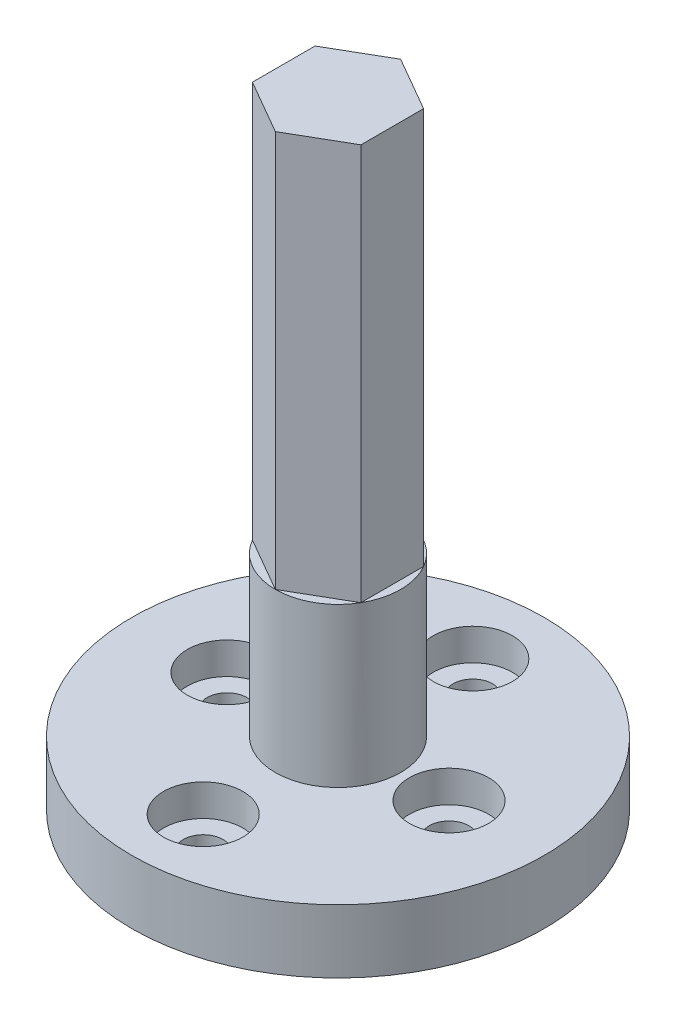
ISO-10303-21;
HEADER;
FILE_DESCRIPTION(('STEP AP214'),'2;1');
FILE_NAME('part.step','',(''),(''),'','','');
FILE_SCHEMA(('AUTOMOTIVE_DESIGN { 1 0 10303 214 1 1 1 1 }'));
ENDSEC;
DATA;
#1=APPLICATION_CONTEXT('core data for automotive mechanical design processes');
#2=APPLICATION_PROTOCOL_DEFINITION('international standard','automotive_design',2000,#1);
#3=PRODUCT_CONTEXT('',#1,'mechanical');
#4=PRODUCT('Part','Part','',(#3));
#5=PRODUCT_RELATED_PRODUCT_CATEGORY('part','',(#4));
#6=PRODUCT_DEFINITION_FORMATION('','',#4);
#7=PRODUCT_DEFINITION_CONTEXT('part definition',#1,'design');
#8=PRODUCT_DEFINITION('design','',#6,#7);
#9=PRODUCT_DEFINITION_SHAPE('','',#8);
#10=(LENGTH_UNIT() NAMED_UNIT(*) SI_UNIT(.MILLI.,.METRE.));
#11=(NAMED_UNIT(*) PLANE_ANGLE_UNIT() SI_UNIT($,.RADIAN.));
#12=(NAMED_UNIT(*) SI_UNIT($,.STERADIAN.) SOLID_ANGLE_UNIT());
#13=UNCERTAINTY_MEASURE_WITH_UNIT(LENGTH_MEASURE(1.E-05),#10,'distance_accuracy_value','');
#14=(GEOMETRIC_REPRESENTATION_CONTEXT(3) GLOBAL_UNCERTAINTY_ASSIGNED_CONTEXT((#13)) GLOBAL_UNIT_ASSIGNED_CONTEXT((#10,
#11,#12)) REPRESENTATION_CONTEXT('',''));
#15=CARTESIAN_POINT('',(0.,0.,0.));
#16=DIRECTION('',(0.,0.,1.));
#17=DIRECTION('',(1.,0.,0.));
#18=AXIS2_PLACEMENT_3D('',#15,#16,#17);
#19=CARTESIAN_POINT('',(0.,39.,0.));
#20=DIRECTION('',(0.,-1.,0.));
#21=DIRECTION('',(0.,0.,-1.));
#22=AXIS2_PLACEMENT_3D('',#19,#20,#21);
#23=CYLINDRICAL_SURFACE('',#22,3.95);
#24=CARTESIAN_POINT('',(0.,4.,0.));
#25=DIRECTION('',(0.,1.,0.));
#26=DIRECTION('',(0.,0.,1.));
#27=AXIS2_PLACEMENT_3D('',#24,#25,#26);
#28=CIRCLE('',#27,3.95);
#29=CARTESIAN_POINT('',(0.,4.,3.95));
#30=VERTEX_POINT('',#29);
#31=EDGE_CURVE('E145',#30,#30,#28,.T.);
#32=ORIENTED_EDGE('',*,*,#31,.T.);
#33=EDGE_LOOP('',(#32));
#34=FACE_BOUND('',#33,.T.);
#35=CARTESIAN_POINT('',(0.,14.,0.));
#36=DIRECTION('',(0.,1.,0.));
#37=DIRECTION('',(0.,0.,1.));
#38=AXIS2_PLACEMENT_3D('',#35,#36,#37);
#39=CIRCLE('',#38,3.95);
#40=CARTESIAN_POINT('',(0.,14.,-3.95));
#41=VERTEX_POINT('',#40);
#42=CARTESIAN_POINT('',(-3.42080034494853,14.,-1.975));
#43=VERTEX_POINT('',#42);
#44=EDGE_CURVE('E12',#41,#43,#39,.T.);
#45=ORIENTED_EDGE('',*,*,#44,.F.);
#46=CARTESIAN_POINT('',(3.42080034494853,14.,-1.975));
#47=VERTEX_POINT('',#46);
#48=EDGE_CURVE('E58',#47,#41,#39,.T.);
#49=ORIENTED_EDGE('',*,*,#48,.F.);
#50=CARTESIAN_POINT('',(3.42080034494853,14.,1.97500000000001));
#51=VERTEX_POINT('',#50);
#52=EDGE_CURVE('E111',#51,#47,#39,.T.);
#53=ORIENTED_EDGE('',*,*,#52,.F.);
#54=CARTESIAN_POINT('',(0.,14.,3.95));
#55=VERTEX_POINT('',#54);
#56=EDGE_CURVE('E148',#55,#51,#39,.T.);
#57=ORIENTED_EDGE('',*,*,#56,.F.);
#58=CARTESIAN_POINT('',(-3.42080034494853,14.,1.975));
#59=VERTEX_POINT('',#58);
#60=EDGE_CURVE('E142',#59,#55,#39,.T.);
#61=ORIENTED_EDGE('',*,*,#60,.F.);
#62=EDGE_CURVE('E52',#43,#59,#39,.T.);
#63=ORIENTED_EDGE('',*,*,#62,.F.);
#64=EDGE_LOOP('',(#45,#49,#53,#57,#61,#63));
#65=FACE_BOUND('',#64,.T.);
#66=ADVANCED_FACE('F48',(#34,#65),#23,.T.);
#67=CARTESIAN_POINT('',(0.,4.,0.));
#68=DIRECTION('',(0.,1.,0.));
#69=DIRECTION('',(0.,0.,1.));
#70=AXIS2_PLACEMENT_3D('',#67,#68,#69);
#71=PLANE('',#70);
#72=CARTESIAN_POINT('',(0.,4.,8.5));
#73=DIRECTION('',(0.,1.,0.));
#74=DIRECTION('',(0.,0.,1.));
#75=AXIS2_PLACEMENT_3D('',#72,#73,#74);
#76=CIRCLE('',#75,2.5);
#77=CARTESIAN_POINT('',(0.,4.,11.));
#78=VERTEX_POINT('',#77);
#79=EDGE_CURVE('E199',#78,#78,#76,.F.);
#80=ORIENTED_EDGE('',*,*,#79,.T.);
#81=EDGE_LOOP('',(#80));
#82=FACE_BOUND('',#81,.T.);
#83=CARTESIAN_POINT('',(-7.,4.,0.));
#84=DIRECTION('',(0.,1.,0.));
#85=DIRECTION('',(0.,0.,1.));
#86=AXIS2_PLACEMENT_3D('',#83,#84,#85);
#87=CIRCLE('',#86,2.5);
#88=CARTESIAN_POINT('',(-7.,4.,2.5));
#89=VERTEX_POINT('',#88);
#90=EDGE_CURVE('E191',#89,#89,#87,.F.);
#91=ORIENTED_EDGE('',*,*,#90,.T.);
#92=EDGE_LOOP('',(#91));
#93=FACE_BOUND('',#92,.T.);
#94=ORIENTED_EDGE('',*,*,#31,.F.);
#95=EDGE_LOOP('',(#94));
#96=FACE_BOUND('',#95,.T.);
#97=CARTESIAN_POINT('',(0.,4.,0.));
#98=DIRECTION('',(0.,1.,0.));
#99=DIRECTION('',(0.,0.,1.));
#100=AXIS2_PLACEMENT_3D('',#97,#98,#99);
#101=CIRCLE('',#100,13.);
#102=CARTESIAN_POINT('',(0.,4.,13.));
#103=VERTEX_POINT('',#102);
#104=EDGE_CURVE('E150',#103,#103,#101,.T.);
#105=ORIENTED_EDGE('',*,*,#104,.T.);
#106=EDGE_LOOP('',(#105));
#107=FACE_BOUND('',#106,.T.);
#108=CARTESIAN_POINT('',(7.,4.,0.));
#109=DIRECTION('',(0.,1.,0.));
#110=DIRECTION('',(0.,0.,1.));
#111=AXIS2_PLACEMENT_3D('',#108,#109,#110);
#112=CIRCLE('',#111,2.5);
#113=CARTESIAN_POINT('',(7.,4.,2.5));
#114=VERTEX_POINT('',#113);
#115=EDGE_CURVE('E195',#114,#114,#112,.F.);
#116=ORIENTED_EDGE('',*,*,#115,.T.);
#117=EDGE_LOOP('',(#116));
#118=FACE_BOUND('',#117,.T.);
#119=CARTESIAN_POINT('',(0.,4.,-8.5));
#120=DIRECTION('',(0.,1.,0.));
#121=DIRECTION('',(0.,0.,1.));
#122=AXIS2_PLACEMENT_3D('',#119,#120,#121);
#123=CIRCLE('',#122,2.5);
#124=CARTESIAN_POINT('',(0.,4.,-6.));
#125=VERTEX_POINT('',#124);
#126=EDGE_CURVE('E171',#125,#125,#123,.F.);
#127=ORIENTED_EDGE('',*,*,#126,.T.);
#128=EDGE_LOOP('',(#127));
#129=FACE_BOUND('',#128,.T.);
#130=ADVANCED_FACE('F206',(#82,#93,#96,#107,#118,#129),#71,.T.);
#131=CARTESIAN_POINT('',(-7.,39.,0.));
#132=DIRECTION('',(0.,-1.,0.));
#133=DIRECTION('',(0.,0.,-1.));
#134=AXIS2_PLACEMENT_3D('',#131,#132,#133);
#135=CYLINDRICAL_SURFACE('',#134,1.25);
#136=CARTESIAN_POINT('',(-7.,0.,0.));
#137=DIRECTION('',(0.,1.,0.));
#138=DIRECTION('',(0.,0.,1.));
#139=AXIS2_PLACEMENT_3D('',#136,#137,#138);
#140=CIRCLE('',#139,1.25);
#141=CARTESIAN_POINT('',(-7.,0.,1.25));
#142=VERTEX_POINT('',#141);
#143=EDGE_CURVE('E166',#142,#142,#140,.T.);
#144=ORIENTED_EDGE('',*,*,#143,.F.);
#145=EDGE_LOOP('',(#144));
#146=FACE_BOUND('',#145,.T.);
#147=CARTESIAN_POINT('',(-7.,2.,0.));
#148=DIRECTION('',(0.,1.,0.));
#149=DIRECTION('',(0.,0.,1.));
#150=AXIS2_PLACEMENT_3D('',#147,#148,#149);
#151=CIRCLE('',#150,1.25);
#152=CARTESIAN_POINT('',(-7.,2.,1.25));
#153=VERTEX_POINT('',#152);
#154=EDGE_CURVE('E159',#153,#153,#151,.T.);
#155=ORIENTED_EDGE('',*,*,#154,.T.);
#156=EDGE_LOOP('',(#155));
#157=FACE_BOUND('',#156,.T.);
#158=ADVANCED_FACE('F330',(#146,#157),#135,.F.);
#159=CARTESIAN_POINT('',(7.,39.,0.));
#160=DIRECTION('',(0.,-1.,0.));
#161=DIRECTION('',(0.,0.,-1.));
#162=AXIS2_PLACEMENT_3D('',#159,#160,#161);
#163=CYLINDRICAL_SURFACE('',#162,1.25);
#164=CARTESIAN_POINT('',(7.,0.,0.));
#165=DIRECTION('',(0.,1.,0.));
#166=DIRECTION('',(0.,0.,1.));
#167=AXIS2_PLACEMENT_3D('',#164,#165,#166);
#168=CIRCLE('',#167,1.25);
#169=CARTESIAN_POINT('',(7.,0.,1.25));
#170=VERTEX_POINT('',#169);
#171=EDGE_CURVE('E170',#170,#170,#168,.T.);
#172=ORIENTED_EDGE('',*,*,#171,.F.);
#173=EDGE_LOOP('',(#172));
#174=FACE_BOUND('',#173,.T.);
#175=CARTESIAN_POINT('',(7.,2.,0.));
#176=DIRECTION('',(0.,1.,0.));
#177=DIRECTION('',(0.,0.,1.));
#178=AXIS2_PLACEMENT_3D('',#175,#176,#177);
#179=CIRCLE('',#178,1.25);
#180=CARTESIAN_POINT('',(7.,2.,1.25));
#181=VERTEX_POINT('',#180);
#182=EDGE_CURVE('E222',#181,#181,#179,.T.);
#183=ORIENTED_EDGE('',*,*,#182,.T.);
#184=EDGE_LOOP('',(#183));
#185=FACE_BOUND('',#184,.T.);
#186=ADVANCED_FACE('F366',(#174,#185),#163,.F.);
#187=CARTESIAN_POINT('',(0.,39.,-8.5));
#188=DIRECTION('',(0.,-1.,0.));
#189=DIRECTION('',(0.,0.,-1.));
#190=AXIS2_PLACEMENT_3D('',#187,#188,#189);
#191=CYLINDRICAL_SURFACE('',#190,1.25);
#192=CARTESIAN_POINT('',(0.,0.,-8.5));
#193=DIRECTION('',(0.,1.,0.));
#194=DIRECTION('',(0.,0.,1.));
#195=AXIS2_PLACEMENT_3D('',#192,#193,#194);
#196=CIRCLE('',#195,1.25);
#197=CARTESIAN_POINT('',(0.,0.,-7.25));
#198=VERTEX_POINT('',#197);
#199=EDGE_CURVE('E175',#198,#198,#196,.T.);
#200=ORIENTED_EDGE('',*,*,#199,.F.);
#201=EDGE_LOOP('',(#200));
#202=FACE_BOUND('',#201,.T.);
#203=CARTESIAN_POINT('',(0.,2.,-8.5));
#204=DIRECTION('',(0.,1.,0.));
#205=DIRECTION('',(0.,0.,1.));
#206=AXIS2_PLACEMENT_3D('',#203,#204,#205);
#207=CIRCLE('',#206,1.25);
#208=CARTESIAN_POINT('',(0.,2.,-7.25));
#209=VERTEX_POINT('',#208);
#210=EDGE_CURVE('E186',#209,#209,#207,.F.);
#211=ORIENTED_EDGE('',*,*,#210,.F.);
#212=EDGE_LOOP('',(#211));
#213=FACE_BOUND('',#212,.T.);
#214=ADVANCED_FACE('F383',(#202,#213),#191,.F.);
#215=CARTESIAN_POINT('',(0.,39.,8.5));
#216=DIRECTION('',(0.,-1.,0.));
#217=DIRECTION('',(0.,0.,-1.));
#218=AXIS2_PLACEMENT_3D('',#215,#216,#217);
#219=CYLINDRICAL_SURFACE('',#218,1.25);
#220=CARTESIAN_POINT('',(0.,0.,8.5));
#221=DIRECTION('',(0.,1.,0.));
#222=DIRECTION('',(0.,0.,1.));
#223=AXIS2_PLACEMENT_3D('',#220,#221,#222);
#224=CIRCLE('',#223,1.25);
#225=CARTESIAN_POINT('',(0.,0.,9.75));
#226=VERTEX_POINT('',#225);
#227=EDGE_CURVE('E165',#226,#226,#224,.T.);
#228=ORIENTED_EDGE('',*,*,#227,.F.);
#229=EDGE_LOOP('',(#228));
#230=FACE_BOUND('',#229,.T.);
#231=CARTESIAN_POINT('',(0.,2.,8.5));
#232=DIRECTION('',(0.,1.,0.));
#233=DIRECTION('',(0.,0.,1.));
#234=AXIS2_PLACEMENT_3D('',#231,#232,#233);
#235=CIRCLE('',#234,1.25);
#236=CARTESIAN_POINT('',(0.,2.,9.75));
#237=VERTEX_POINT('',#236);
#238=EDGE_CURVE('E182',#237,#237,#235,.F.);
#239=ORIENTED_EDGE('',*,*,#238,.F.);
#240=EDGE_LOOP('',(#239));
#241=FACE_BOUND('',#240,.T.);
#242=ADVANCED_FACE('F349',(#230,#241),#219,.F.);
#243=CARTESIAN_POINT('',(0.,4.,0.));
#244=DIRECTION('',(0.,-1.,0.));
#245=DIRECTION('',(0.,0.,-1.));
#246=AXIS2_PLACEMENT_3D('',#243,#244,#245);
#247=CYLINDRICAL_SURFACE('',#246,13.);
#248=ORIENTED_EDGE('',*,*,#104,.F.);
#249=EDGE_LOOP('',(#248));
#250=FACE_BOUND('',#249,.T.);
#251=CARTESIAN_POINT('',(0.,0.,0.));
#252=DIRECTION('',(0.,1.,0.));
#253=DIRECTION('',(0.,0.,1.));
#254=AXIS2_PLACEMENT_3D('',#251,#252,#253);
#255=CIRCLE('',#254,13.);
#256=CARTESIAN_POINT('',(0.,0.,13.));
#257=VERTEX_POINT('',#256);
#258=EDGE_CURVE('E156',#257,#257,#255,.T.);
#259=ORIENTED_EDGE('',*,*,#258,.T.);
#260=EDGE_LOOP('',(#259));
#261=FACE_BOUND('',#260,.T.);
#262=ADVANCED_FACE('F50',(#250,#261),#247,.T.);
#263=CARTESIAN_POINT('',(0.,0.,0.));
#264=DIRECTION('',(0.,1.,0.));
#265=DIRECTION('',(0.,0.,1.));
#266=AXIS2_PLACEMENT_3D('',#263,#264,#265);
#267=PLANE('',#266);
#268=CARTESIAN_POINT('',(0.,0.,0.));
#269=DIRECTION('',(0.,1.,0.));
#270=DIRECTION('',(0.,0.,1.));
#271=AXIS2_PLACEMENT_3D('',#268,#269,#270);
#272=CIRCLE('',#271,1.625);
#273=CARTESIAN_POINT('',(0.,0.,1.625));
#274=VERTEX_POINT('',#273);
#275=EDGE_CURVE('E225',#274,#274,#272,.T.);
#276=ORIENTED_EDGE('',*,*,#275,.T.);
#277=EDGE_LOOP('',(#276));
#278=FACE_BOUND('',#277,.T.);
#279=ORIENTED_EDGE('',*,*,#227,.T.);
#280=EDGE_LOOP('',(#279));
#281=FACE_BOUND('',#280,.T.);
#282=ORIENTED_EDGE('',*,*,#199,.T.);
#283=EDGE_LOOP('',(#282));
#284=FACE_BOUND('',#283,.T.);
#285=ORIENTED_EDGE('',*,*,#171,.T.);
#286=EDGE_LOOP('',(#285));
#287=FACE_BOUND('',#286,.T.);
#288=ORIENTED_EDGE('',*,*,#143,.T.);
#289=EDGE_LOOP('',(#288));
#290=FACE_BOUND('',#289,.T.);
#291=ORIENTED_EDGE('',*,*,#258,.F.);
#292=EDGE_LOOP('',(#291));
#293=FACE_BOUND('',#292,.T.);
#294=ADVANCED_FACE('F336',(#278,#281,#284,#287,#290,#293),#267,.F.);
#295=CARTESIAN_POINT('',(0.,2.,8.5));
#296=DIRECTION('',(0.,1.,0.));
#297=DIRECTION('',(0.,0.,1.));
#298=AXIS2_PLACEMENT_3D('',#295,#296,#297);
#299=PLANE('',#298);
#300=CARTESIAN_POINT('',(0.,2.,8.5));
#301=DIRECTION('',(0.,1.,0.));
#302=DIRECTION('',(0.,0.,1.));
#303=AXIS2_PLACEMENT_3D('',#300,#301,#302);
#304=CIRCLE('',#303,2.5);
#305=CARTESIAN_POINT('',(0.,2.,11.));
#306=VERTEX_POINT('',#305);
#307=EDGE_CURVE('E218',#306,#306,#304,.T.);
#308=ORIENTED_EDGE('',*,*,#307,.T.);
#309=EDGE_LOOP('',(#308));
#310=FACE_BOUND('',#309,.T.);
#311=ORIENTED_EDGE('',*,*,#238,.T.);
#312=EDGE_LOOP('',(#311));
#313=FACE_BOUND('',#312,.T.);
#314=ADVANCED_FACE('F338',(#310,#313),#299,.T.);
#315=CARTESIAN_POINT('',(0.,39.,8.5));
#316=DIRECTION('',(0.,-1.,0.));
#317=DIRECTION('',(0.,0.,-1.));
#318=AXIS2_PLACEMENT_3D('',#315,#316,#317);
#319=CYLINDRICAL_SURFACE('',#318,2.5);
#320=ORIENTED_EDGE('',*,*,#79,.F.);
#321=EDGE_LOOP('',(#320));
#322=FACE_BOUND('',#321,.T.);
#323=ORIENTED_EDGE('',*,*,#307,.F.);
#324=EDGE_LOOP('',(#323));
#325=FACE_BOUND('',#324,.T.);
#326=ADVANCED_FACE('F345',(#322,#325),#319,.F.);
#327=CARTESIAN_POINT('',(0.,2.,-8.5));
#328=DIRECTION('',(0.,1.,0.));
#329=DIRECTION('',(0.,0.,1.));
#330=AXIS2_PLACEMENT_3D('',#327,#328,#329);
#331=PLANE('',#330);
#332=CARTESIAN_POINT('',(0.,2.,-8.5));
#333=DIRECTION('',(0.,1.,0.));
#334=DIRECTION('',(0.,0.,1.));
#335=AXIS2_PLACEMENT_3D('',#332,#333,#334);
#336=CIRCLE('',#335,2.5);
#337=CARTESIAN_POINT('',(0.,2.,-6.));
#338=VERTEX_POINT('',#337);
#339=EDGE_CURVE('E187',#338,#338,#336,.T.);
#340=ORIENTED_EDGE('',*,*,#339,.T.);
#341=EDGE_LOOP('',(#340));
#342=FACE_BOUND('',#341,.T.);
#343=ORIENTED_EDGE('',*,*,#210,.T.);
#344=EDGE_LOOP('',(#343));
#345=FACE_BOUND('',#344,.T.);
#346=ADVANCED_FACE('F212',(#342,#345),#331,.T.);
#347=CARTESIAN_POINT('',(0.,39.,-8.5));
#348=DIRECTION('',(0.,-1.,0.));
#349=DIRECTION('',(0.,0.,-1.));
#350=AXIS2_PLACEMENT_3D('',#347,#348,#349);
#351=CYLINDRICAL_SURFACE('',#350,2.5);
#352=ORIENTED_EDGE('',*,*,#126,.F.);
#353=EDGE_LOOP('',(#352));
#354=FACE_BOUND('',#353,.T.);
#355=ORIENTED_EDGE('',*,*,#339,.F.);
#356=EDGE_LOOP('',(#355));
#357=FACE_BOUND('',#356,.T.);
#358=ADVANCED_FACE('F208',(#354,#357),#351,.F.);
#359=CARTESIAN_POINT('',(7.,39.,0.));
#360=DIRECTION('',(0.,-1.,0.));
#361=DIRECTION('',(0.,0.,-1.));
#362=AXIS2_PLACEMENT_3D('',#359,#360,#361);
#363=CYLINDRICAL_SURFACE('',#362,2.5);
#364=ORIENTED_EDGE('',*,*,#115,.F.);
#365=EDGE_LOOP('',(#364));
#366=FACE_BOUND('',#365,.T.);
#367=CARTESIAN_POINT('',(7.,2.,0.));
#368=DIRECTION('',(0.,1.,0.));
#369=DIRECTION('',(0.,0.,1.));
#370=AXIS2_PLACEMENT_3D('',#367,#368,#369);
#371=CIRCLE('',#370,2.5);
#372=CARTESIAN_POINT('',(7.,2.,2.5));
#373=VERTEX_POINT('',#372);
#374=EDGE_CURVE('E228',#373,#373,#371,.T.);
#375=ORIENTED_EDGE('',*,*,#374,.F.);
#376=EDGE_LOOP('',(#375));
#377=FACE_BOUND('',#376,.T.);
#378=ADVANCED_FACE('F211',(#366,#377),#363,.F.);
#379=CARTESIAN_POINT('',(7.,2.,0.));
#380=DIRECTION('',(0.,1.,0.));
#381=DIRECTION('',(0.,0.,1.));
#382=AXIS2_PLACEMENT_3D('',#379,#380,#381);
#383=PLANE('',#382);
#384=ORIENTED_EDGE('',*,*,#182,.F.);
#385=EDGE_LOOP('',(#384));
#386=FACE_BOUND('',#385,.T.);
#387=ORIENTED_EDGE('',*,*,#374,.T.);
#388=EDGE_LOOP('',(#387));
#389=FACE_BOUND('',#388,.T.);
#390=ADVANCED_FACE('F376',(#386,#389),#383,.T.);
#391=CARTESIAN_POINT('',(-7.,39.,0.));
#392=DIRECTION('',(0.,-1.,0.));
#393=DIRECTION('',(0.,0.,-1.));
#394=AXIS2_PLACEMENT_3D('',#391,#392,#393);
#395=CYLINDRICAL_SURFACE('',#394,2.5);
#396=ORIENTED_EDGE('',*,*,#90,.F.);
#397=EDGE_LOOP('',(#396));
#398=FACE_BOUND('',#397,.T.);
#399=CARTESIAN_POINT('',(-7.,2.,0.));
#400=DIRECTION('',(0.,1.,0.));
#401=DIRECTION('',(0.,0.,1.));
#402=AXIS2_PLACEMENT_3D('',#399,#400,#401);
#403=CIRCLE('',#402,2.5);
#404=CARTESIAN_POINT('',(-7.,2.,2.5));
#405=VERTEX_POINT('',#404);
#406=EDGE_CURVE('E234',#405,#405,#403,.T.);
#407=ORIENTED_EDGE('',*,*,#406,.F.);
#408=EDGE_LOOP('',(#407));
#409=FACE_BOUND('',#408,.T.);
#410=ADVANCED_FACE('F370',(#398,#409),#395,.F.);
#411=CARTESIAN_POINT('',(-7.,2.,0.));
#412=DIRECTION('',(0.,1.,0.));
#413=DIRECTION('',(0.,0.,1.));
#414=AXIS2_PLACEMENT_3D('',#411,#412,#413);
#415=PLANE('',#414);
#416=ORIENTED_EDGE('',*,*,#154,.F.);
#417=EDGE_LOOP('',(#416));
#418=FACE_BOUND('',#417,.T.);
#419=ORIENTED_EDGE('',*,*,#406,.T.);
#420=EDGE_LOOP('',(#419));
#421=FACE_BOUND('',#420,.T.);
#422=ADVANCED_FACE('F369',(#418,#421),#415,.T.);
#423=CARTESIAN_POINT('',(0.,3.,0.));
#424=DIRECTION('',(0.,-1.,0.));
#425=DIRECTION('',(0.,0.,-1.));
#426=AXIS2_PLACEMENT_3D('',#423,#424,#425);
#427=CYLINDRICAL_SURFACE('',#426,1.625);
#428=CARTESIAN_POINT('',(0.,3.,0.));
#429=DIRECTION('',(0.,1.,0.));
#430=DIRECTION('',(0.,0.,1.));
#431=AXIS2_PLACEMENT_3D('',#428,#429,#430);
#432=CIRCLE('',#431,1.625);
#433=CARTESIAN_POINT('',(0.,3.,1.625));
#434=VERTEX_POINT('',#433);
#435=EDGE_CURVE('E237',#434,#434,#432,.T.);
#436=ORIENTED_EDGE('',*,*,#435,.T.);
#437=EDGE_LOOP('',(#436));
#438=FACE_BOUND('',#437,.T.);
#439=ORIENTED_EDGE('',*,*,#275,.F.);
#440=EDGE_LOOP('',(#439));
#441=FACE_BOUND('',#440,.T.);
#442=ADVANCED_FACE('F320',(#438,#441),#427,.F.);
#443=CARTESIAN_POINT('',(0.,3.,0.));
#444=DIRECTION('',(0.,1.,0.));
#445=DIRECTION('',(0.,0.,1.));
#446=AXIS2_PLACEMENT_3D('',#443,#444,#445);
#447=PLANE('',#446);
#448=ORIENTED_EDGE('',*,*,#435,.F.);
#449=EDGE_LOOP('',(#448));
#450=FACE_BOUND('',#449,.T.);
#451=ADVANCED_FACE('F312',(#450),#447,.F.);
#452=CARTESIAN_POINT('',(0.,14.,0.));
#453=DIRECTION('',(0.,1.,0.));
#454=DIRECTION('',(0.,0.,1.));
#455=AXIS2_PLACEMENT_3D('',#452,#453,#454);
#456=PLANE('',#455);
#457=ORIENTED_EDGE('',*,*,#56,.T.);
#458=DIRECTION('',(0.866025403784439,0.,-0.499999999999999));
#459=VECTOR('',#458,1.);
#460=CARTESIAN_POINT('',(0.,14.,3.95));
#461=LINE('',#460,#459);
#462=EDGE_CURVE('E282',#55,#51,#461,.T.);
#463=ORIENTED_EDGE('',*,*,#462,.F.);
#464=EDGE_LOOP('',(#457,#463));
#465=FACE_BOUND('',#464,.T.);
#466=ADVANCED_FACE('F310',(#465),#456,.T.);
#467=ORIENTED_EDGE('',*,*,#52,.T.);
#468=DIRECTION('',(0.,0.,-1.));
#469=VECTOR('',#468,1.);
#470=CARTESIAN_POINT('',(3.42080034494853,14.,1.97500000000001));
#471=LINE('',#470,#469);
#472=EDGE_CURVE('E127',#51,#47,#471,.T.);
#473=ORIENTED_EDGE('',*,*,#472,.F.);
#474=EDGE_LOOP('',(#467,#473));
#475=FACE_BOUND('',#474,.T.);
#476=ADVANCED_FACE('F305',(#475),#456,.T.);
#477=ORIENTED_EDGE('',*,*,#48,.T.);
#478=DIRECTION('',(-0.866025403784439,0.,-0.5));
#479=VECTOR('',#478,1.);
#480=CARTESIAN_POINT('',(3.42080034494853,14.,-1.975));
#481=LINE('',#480,#479);
#482=EDGE_CURVE('E105',#47,#41,#481,.T.);
#483=ORIENTED_EDGE('',*,*,#482,.F.);
#484=EDGE_LOOP('',(#477,#483));
#485=FACE_BOUND('',#484,.T.);
#486=ADVANCED_FACE('F103',(#485),#456,.T.);
#487=ORIENTED_EDGE('',*,*,#44,.T.);
#488=DIRECTION('',(-0.866025403784439,0.,0.5));
#489=VECTOR('',#488,1.);
#490=CARTESIAN_POINT('',(0.,14.,-3.95));
#491=LINE('',#490,#489);
#492=EDGE_CURVE('E118',#41,#43,#491,.T.);
#493=ORIENTED_EDGE('',*,*,#492,.F.);
#494=EDGE_LOOP('',(#487,#493));
#495=FACE_BOUND('',#494,.T.);
#496=ADVANCED_FACE('F130',(#495),#456,.T.);
#497=ORIENTED_EDGE('',*,*,#62,.T.);
#498=DIRECTION('',(0.,0.,1.));
#499=VECTOR('',#498,1.);
#500=CARTESIAN_POINT('',(-3.42080034494853,14.,-1.975));
#501=LINE('',#500,#499);
#502=EDGE_CURVE('E65',#43,#59,#501,.T.);
#503=ORIENTED_EDGE('',*,*,#502,.F.);
#504=EDGE_LOOP('',(#497,#503));
#505=FACE_BOUND('',#504,.T.);
#506=ADVANCED_FACE('F325',(#505),#456,.T.);
#507=ORIENTED_EDGE('',*,*,#60,.T.);
#508=DIRECTION('',(0.866025403784439,0.,0.5));
#509=VECTOR('',#508,1.);
#510=CARTESIAN_POINT('',(-3.42080034494853,14.,1.975));
#511=LINE('',#510,#509);
#512=EDGE_CURVE('E286',#59,#55,#511,.T.);
#513=ORIENTED_EDGE('',*,*,#512,.F.);
#514=EDGE_LOOP('',(#507,#513));
#515=FACE_BOUND('',#514,.T.);
#516=ADVANCED_FACE('F314',(#515),#456,.T.);
#517=CARTESIAN_POINT('',(3.42080034494853,14.,-1.975));
#518=DIRECTION('',(0.5,0.,-0.866025403784439));
#519=DIRECTION('',(-0.866025403784439,0.,-0.5));
#520=AXIS2_PLACEMENT_3D('',#517,#518,#519);
#521=PLANE('',#520);
#522=DIRECTION('',(-0.866025403784439,0.,-0.5));
#523=VECTOR('',#522,1.);
#524=CARTESIAN_POINT('',(3.42080034494853,39.,-1.975));
#525=LINE('',#524,#523);
#526=CARTESIAN_POINT('',(3.42080034494853,39.,-1.975));
#527=VERTEX_POINT('',#526);
#528=CARTESIAN_POINT('',(0.,39.,-3.95));
#529=VERTEX_POINT('',#528);
#530=EDGE_CURVE('E277',#527,#529,#525,.T.);
#531=ORIENTED_EDGE('',*,*,#530,.F.);
#532=DIRECTION('',(0.,1.,0.));
#533=VECTOR('',#532,1.);
#534=CARTESIAN_POINT('',(3.42080034494853,14.,-1.975));
#535=LINE('',#534,#533);
#536=EDGE_CURVE('E135',#47,#527,#535,.T.);
#537=ORIENTED_EDGE('',*,*,#536,.F.);
#538=ORIENTED_EDGE('',*,*,#482,.T.);
#539=DIRECTION('',(0.,1.,0.));
#540=VECTOR('',#539,1.);
#541=CARTESIAN_POINT('',(0.,14.,-3.95));
#542=LINE('',#541,#540);
#543=EDGE_CURVE('E115',#41,#529,#542,.T.);
#544=ORIENTED_EDGE('',*,*,#543,.T.);
#545=EDGE_LOOP('',(#531,#537,#538,#544));
#546=FACE_BOUND('',#545,.T.);
#547=ADVANCED_FACE('F134',(#546),#521,.T.);
#548=CARTESIAN_POINT('',(3.42080034494853,14.,1.97500000000001));
#549=DIRECTION('',(1.,0.,0.));
#550=DIRECTION('',(0.,0.,-1.));
#551=AXIS2_PLACEMENT_3D('',#548,#549,#550);
#552=PLANE('',#551);
#553=DIRECTION('',(0.,0.,-1.));
#554=VECTOR('',#553,1.);
#555=CARTESIAN_POINT('',(3.42080034494853,39.,1.97500000000001));
#556=LINE('',#555,#554);
#557=CARTESIAN_POINT('',(3.42080034494853,39.,1.97500000000001));
#558=VERTEX_POINT('',#557);
#559=EDGE_CURVE('E137',#558,#527,#556,.T.);
#560=ORIENTED_EDGE('',*,*,#559,.F.);
#561=DIRECTION('',(0.,1.,0.));
#562=VECTOR('',#561,1.);
#563=CARTESIAN_POINT('',(3.42080034494853,14.,1.97500000000001));
#564=LINE('',#563,#562);
#565=EDGE_CURVE('E257',#51,#558,#564,.T.);
#566=ORIENTED_EDGE('',*,*,#565,.F.);
#567=ORIENTED_EDGE('',*,*,#472,.T.);
#568=ORIENTED_EDGE('',*,*,#536,.T.);
#569=EDGE_LOOP('',(#560,#566,#567,#568));
#570=FACE_BOUND('',#569,.T.);
#571=ADVANCED_FACE('F514',(#570),#552,.T.);
#572=CARTESIAN_POINT('',(0.,14.,3.95));
#573=DIRECTION('',(0.499999999999999,0.,0.866025403784439));
#574=DIRECTION('',(0.866025403784439,0.,-0.499999999999999));
#575=AXIS2_PLACEMENT_3D('',#572,#573,#574);
#576=PLANE('',#575);
#577=DIRECTION('',(0.866025403784439,0.,-0.499999999999999));
#578=VECTOR('',#577,1.);
#579=CARTESIAN_POINT('',(0.,39.,3.95));
#580=LINE('',#579,#578);
#581=CARTESIAN_POINT('',(0.,39.,3.95));
#582=VERTEX_POINT('',#581);
#583=EDGE_CURVE('E265',#582,#558,#580,.T.);
#584=ORIENTED_EDGE('',*,*,#583,.F.);
#585=DIRECTION('',(0.,1.,0.));
#586=VECTOR('',#585,1.);
#587=CARTESIAN_POINT('',(0.,14.,3.95));
#588=LINE('',#587,#586);
#589=EDGE_CURVE('E254',#55,#582,#588,.T.);
#590=ORIENTED_EDGE('',*,*,#589,.F.);
#591=ORIENTED_EDGE('',*,*,#462,.T.);
#592=ORIENTED_EDGE('',*,*,#565,.T.);
#593=EDGE_LOOP('',(#584,#590,#591,#592));
#594=FACE_BOUND('',#593,.T.);
#595=ADVANCED_FACE('F308',(#594),#576,.T.);
#596=CARTESIAN_POINT('',(-3.42080034494853,14.,1.975));
#597=DIRECTION('',(-0.5,0.,0.866025403784439));
#598=DIRECTION('',(0.866025403784439,0.,0.5));
#599=AXIS2_PLACEMENT_3D('',#596,#597,#598);
#600=PLANE('',#599);
#601=DIRECTION('',(0.866025403784439,0.,0.5));
#602=VECTOR('',#601,1.);
#603=CARTESIAN_POINT('',(-3.42080034494853,39.,1.975));
#604=LINE('',#603,#602);
#605=CARTESIAN_POINT('',(-3.42080034494853,39.,1.975));
#606=VERTEX_POINT('',#605);
#607=EDGE_CURVE('E269',#606,#582,#604,.T.);
#608=ORIENTED_EDGE('',*,*,#607,.F.);
#609=DIRECTION('',(0.,1.,0.));
#610=VECTOR('',#609,1.);
#611=CARTESIAN_POINT('',(-3.42080034494853,14.,1.975));
#612=LINE('',#611,#610);
#613=EDGE_CURVE('E251',#59,#606,#612,.T.);
#614=ORIENTED_EDGE('',*,*,#613,.F.);
#615=ORIENTED_EDGE('',*,*,#512,.T.);
#616=ORIENTED_EDGE('',*,*,#589,.T.);
#617=EDGE_LOOP('',(#608,#614,#615,#616));
#618=FACE_BOUND('',#617,.T.);
#619=ADVANCED_FACE('F294',(#618),#600,.T.);
#620=CARTESIAN_POINT('',(-3.42080034494853,14.,-1.975));
#621=DIRECTION('',(-1.,0.,0.));
#622=DIRECTION('',(0.,0.,1.));
#623=AXIS2_PLACEMENT_3D('',#620,#621,#622);
#624=PLANE('',#623);
#625=DIRECTION('',(0.,0.,1.));
#626=VECTOR('',#625,1.);
#627=CARTESIAN_POINT('',(-3.42080034494853,39.,-1.975));
#628=LINE('',#627,#626);
#629=CARTESIAN_POINT('',(-3.42080034494853,39.,-1.975));
#630=VERTEX_POINT('',#629);
#631=EDGE_CURVE('E70',#630,#606,#628,.T.);
#632=ORIENTED_EDGE('',*,*,#631,.F.);
#633=DIRECTION('',(0.,1.,0.));
#634=VECTOR('',#633,1.);
#635=CARTESIAN_POINT('',(-3.42080034494853,14.,-1.975));
#636=LINE('',#635,#634);
#637=EDGE_CURVE('E126',#43,#630,#636,.T.);
#638=ORIENTED_EDGE('',*,*,#637,.F.);
#639=ORIENTED_EDGE('',*,*,#502,.T.);
#640=ORIENTED_EDGE('',*,*,#613,.T.);
#641=EDGE_LOOP('',(#632,#638,#639,#640));
#642=FACE_BOUND('',#641,.T.);
#643=ADVANCED_FACE('F538',(#642),#624,.T.);
#644=CARTESIAN_POINT('',(0.,14.,-3.95));
#645=DIRECTION('',(-0.5,0.,-0.866025403784439));
#646=DIRECTION('',(-0.866025403784439,0.,0.5));
#647=AXIS2_PLACEMENT_3D('',#644,#645,#646);
#648=PLANE('',#647);
#649=DIRECTION('',(-0.866025403784439,0.,0.5));
#650=VECTOR('',#649,1.);
#651=CARTESIAN_POINT('',(0.,39.,-3.95));
#652=LINE('',#651,#650);
#653=EDGE_CURVE('E121',#529,#630,#652,.T.);
#654=ORIENTED_EDGE('',*,*,#653,.F.);
#655=ORIENTED_EDGE('',*,*,#543,.F.);
#656=ORIENTED_EDGE('',*,*,#492,.T.);
#657=ORIENTED_EDGE('',*,*,#637,.T.);
#658=EDGE_LOOP('',(#654,#655,#656,#657));
#659=FACE_BOUND('',#658,.T.);
#660=ADVANCED_FACE('F117',(#659),#648,.T.);
#661=CARTESIAN_POINT('',(0.,39.,0.));
#662=DIRECTION('',(0.,1.,0.));
#663=DIRECTION('',(0.,0.,1.));
#664=AXIS2_PLACEMENT_3D('',#661,#662,#663);
#665=PLANE('',#664);
#666=ORIENTED_EDGE('',*,*,#559,.T.);
#667=ORIENTED_EDGE('',*,*,#530,.T.);
#668=ORIENTED_EDGE('',*,*,#653,.T.);
#669=ORIENTED_EDGE('',*,*,#631,.T.);
#670=ORIENTED_EDGE('',*,*,#607,.T.);
#671=ORIENTED_EDGE('',*,*,#583,.T.);
#672=EDGE_LOOP('',(#666,#667,#668,#669,#670,#671));
#673=FACE_BOUND('',#672,.T.);
#674=ADVANCED_FACE('F334',(#673),#665,.T.);
#675=CLOSED_SHELL('',(#66,#130,#158,#186,#214,#242,#262,#294,#314,#326,#346,#358,#378,#390,#410,
#422,#442,#451,#466,#476,#486,#496,#506,#516,#547,#571,#595,#619,#643,#660,#674));
#676=MANIFOLD_SOLID_BREP('B2',#675);
#677=ADVANCED_BREP_SHAPE_REPRESENTATION('',(#18,#676),#14);
#678=SHAPE_DEFINITION_REPRESENTATION(#9,#677);
ENDSEC;
END-ISO-10303-21;
